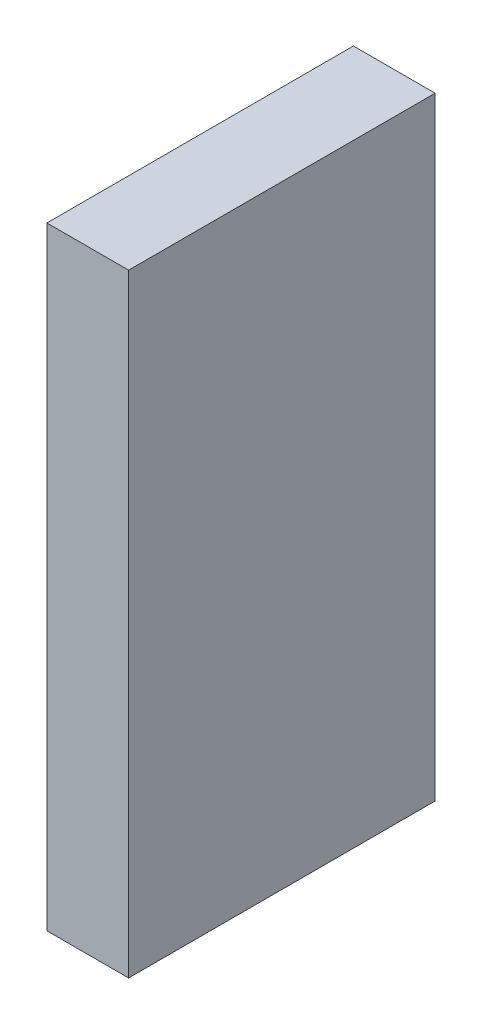
ISO-10303-21;
HEADER;
FILE_DESCRIPTION(('STEP AP214'),'2;1');
FILE_NAME('part.step','',(''),(''),'','','');
FILE_SCHEMA(('AUTOMOTIVE_DESIGN { 1 0 10303 214 1 1 1 1 }'));
ENDSEC;
DATA;
#1=APPLICATION_CONTEXT('core data for automotive mechanical design processes');
#2=APPLICATION_PROTOCOL_DEFINITION('international standard','automotive_design',2000,#1);
#3=PRODUCT_CONTEXT('',#1,'mechanical');
#4=PRODUCT('Part','Part','',(#3));
#5=PRODUCT_RELATED_PRODUCT_CATEGORY('part','',(#4));
#6=PRODUCT_DEFINITION_FORMATION('','',#4);
#7=PRODUCT_DEFINITION_CONTEXT('part definition',#1,'design');
#8=PRODUCT_DEFINITION('design','',#6,#7);
#9=PRODUCT_DEFINITION_SHAPE('','',#8);
#10=(LENGTH_UNIT() NAMED_UNIT(*) SI_UNIT(.MILLI.,.METRE.));
#11=(NAMED_UNIT(*) PLANE_ANGLE_UNIT() SI_UNIT($,.RADIAN.));
#12=(NAMED_UNIT(*) SI_UNIT($,.STERADIAN.) SOLID_ANGLE_UNIT());
#13=UNCERTAINTY_MEASURE_WITH_UNIT(LENGTH_MEASURE(1.E-05),#10,'distance_accuracy_value','');
#14=(GEOMETRIC_REPRESENTATION_CONTEXT(3) GLOBAL_UNCERTAINTY_ASSIGNED_CONTEXT((#13)) GLOBAL_UNIT_ASSIGNED_CONTEXT((#10,
#11,#12)) REPRESENTATION_CONTEXT('',''));
#15=CARTESIAN_POINT('',(0.,0.,0.));
#16=DIRECTION('',(0.,0.,1.));
#17=DIRECTION('',(1.,0.,0.));
#18=AXIS2_PLACEMENT_3D('',#15,#16,#17);
#19=CARTESIAN_POINT('',(146.,700.,-215.));
#20=DIRECTION('',(-1.,0.,0.));
#21=DIRECTION('',(0.,0.,1.));
#22=AXIS2_PLACEMENT_3D('',#19,#20,#21);
#23=PLANE('',#22);
#24=DIRECTION('',(0.,-1.,0.));
#25=VECTOR('',#24,1.);
#26=CARTESIAN_POINT('',(146.,700.,-185.));
#27=LINE('',#26,#25);
#28=CARTESIAN_POINT('',(146.,760.,-185.));
#29=VERTEX_POINT('',#28);
#30=CARTESIAN_POINT('',(146.,700.,-185.));
#31=VERTEX_POINT('',#30);
#32=EDGE_CURVE('E103',#29,#31,#27,.T.);
#33=ORIENTED_EDGE('',*,*,#32,.F.);
#34=DIRECTION('',(0.,0.,1.));
#35=VECTOR('',#34,1.);
#36=CARTESIAN_POINT('',(146.,760.,-215.));
#37=LINE('',#36,#35);
#38=CARTESIAN_POINT('',(146.,760.,-215.));
#39=VERTEX_POINT('',#38);
#40=EDGE_CURVE('E11',#39,#29,#37,.T.);
#41=ORIENTED_EDGE('',*,*,#40,.F.);
#42=DIRECTION('',(0.,-1.,0.));
#43=VECTOR('',#42,1.);
#44=CARTESIAN_POINT('',(146.,700.,-215.));
#45=LINE('',#44,#43);
#46=CARTESIAN_POINT('',(146.,700.,-215.));
#47=VERTEX_POINT('',#46);
#48=EDGE_CURVE('E97',#39,#47,#45,.T.);
#49=ORIENTED_EDGE('',*,*,#48,.T.);
#50=DIRECTION('',(0.,0.,1.));
#51=VECTOR('',#50,1.);
#52=CARTESIAN_POINT('',(146.,700.,-215.));
#53=LINE('',#52,#51);
#54=EDGE_CURVE('E42',#47,#31,#53,.T.);
#55=ORIENTED_EDGE('',*,*,#54,.T.);
#56=EDGE_LOOP('',(#33,#41,#49,#55));
#57=FACE_BOUND('',#56,.T.);
#58=ADVANCED_FACE('F39',(#57),#23,.T.);
#59=CARTESIAN_POINT('',(146.,760.,-215.));
#60=DIRECTION('',(0.,1.,0.));
#61=DIRECTION('',(0.,0.,1.));
#62=AXIS2_PLACEMENT_3D('',#59,#60,#61);
#63=PLANE('',#62);
#64=DIRECTION('',(-1.,0.,0.));
#65=VECTOR('',#64,1.);
#66=CARTESIAN_POINT('',(146.,760.,-185.));
#67=LINE('',#66,#65);
#68=CARTESIAN_POINT('',(154.,760.,-185.));
#69=VERTEX_POINT('',#68);
#70=EDGE_CURVE('E99',#69,#29,#67,.T.);
#71=ORIENTED_EDGE('',*,*,#70,.F.);
#72=DIRECTION('',(0.,0.,1.));
#73=VECTOR('',#72,1.);
#74=CARTESIAN_POINT('',(154.,760.,-215.));
#75=LINE('',#74,#73);
#76=CARTESIAN_POINT('',(154.,760.,-215.));
#77=VERTEX_POINT('',#76);
#78=EDGE_CURVE('E48',#77,#69,#75,.T.);
#79=ORIENTED_EDGE('',*,*,#78,.F.);
#80=DIRECTION('',(-1.,0.,0.));
#81=VECTOR('',#80,1.);
#82=CARTESIAN_POINT('',(146.,760.,-215.));
#83=LINE('',#82,#81);
#84=EDGE_CURVE('E94',#77,#39,#83,.T.);
#85=ORIENTED_EDGE('',*,*,#84,.T.);
#86=ORIENTED_EDGE('',*,*,#40,.T.);
#87=EDGE_LOOP('',(#71,#79,#85,#86));
#88=FACE_BOUND('',#87,.T.);
#89=ADVANCED_FACE('F113',(#88),#63,.T.);
#90=CARTESIAN_POINT('',(154.,700.,-215.));
#91=DIRECTION('',(1.,0.,0.));
#92=DIRECTION('',(0.,0.,-1.));
#93=AXIS2_PLACEMENT_3D('',#90,#91,#92);
#94=PLANE('',#93);
#95=DIRECTION('',(0.,1.,0.));
#96=VECTOR('',#95,1.);
#97=CARTESIAN_POINT('',(154.,700.,-185.));
#98=LINE('',#97,#96);
#99=CARTESIAN_POINT('',(154.,700.,-185.));
#100=VERTEX_POINT('',#99);
#101=EDGE_CURVE('E89',#100,#69,#98,.T.);
#102=ORIENTED_EDGE('',*,*,#101,.F.);
#103=DIRECTION('',(0.,0.,1.));
#104=VECTOR('',#103,1.);
#105=CARTESIAN_POINT('',(154.,700.,-215.));
#106=LINE('',#105,#104);
#107=CARTESIAN_POINT('',(154.,700.,-215.));
#108=VERTEX_POINT('',#107);
#109=EDGE_CURVE('E84',#108,#100,#106,.T.);
#110=ORIENTED_EDGE('',*,*,#109,.F.);
#111=DIRECTION('',(0.,1.,0.));
#112=VECTOR('',#111,1.);
#113=CARTESIAN_POINT('',(154.,700.,-215.));
#114=LINE('',#113,#112);
#115=EDGE_CURVE('E87',#108,#77,#114,.T.);
#116=ORIENTED_EDGE('',*,*,#115,.T.);
#117=ORIENTED_EDGE('',*,*,#78,.T.);
#118=EDGE_LOOP('',(#102,#110,#116,#117));
#119=FACE_BOUND('',#118,.T.);
#120=ADVANCED_FACE('F86',(#119),#94,.T.);
#121=CARTESIAN_POINT('',(146.,700.,-215.));
#122=DIRECTION('',(0.,-1.,0.));
#123=DIRECTION('',(0.,0.,-1.));
#124=AXIS2_PLACEMENT_3D('',#121,#122,#123);
#125=PLANE('',#124);
#126=DIRECTION('',(1.,0.,0.));
#127=VECTOR('',#126,1.);
#128=CARTESIAN_POINT('',(146.,700.,-185.));
#129=LINE('',#128,#127);
#130=EDGE_CURVE('E106',#31,#100,#129,.T.);
#131=ORIENTED_EDGE('',*,*,#130,.F.);
#132=ORIENTED_EDGE('',*,*,#54,.F.);
#133=DIRECTION('',(1.,0.,0.));
#134=VECTOR('',#133,1.);
#135=CARTESIAN_POINT('',(146.,700.,-215.));
#136=LINE('',#135,#134);
#137=EDGE_CURVE('E93',#47,#108,#136,.T.);
#138=ORIENTED_EDGE('',*,*,#137,.T.);
#139=ORIENTED_EDGE('',*,*,#109,.T.);
#140=EDGE_LOOP('',(#131,#132,#138,#139));
#141=FACE_BOUND('',#140,.T.);
#142=ADVANCED_FACE('F96',(#141),#125,.T.);
#143=CARTESIAN_POINT('',(0.,0.,-215.));
#144=DIRECTION('',(0.,0.,-1.));
#145=DIRECTION('',(-1.,0.,0.));
#146=AXIS2_PLACEMENT_3D('',#143,#144,#145);
#147=PLANE('',#146);
#148=ORIENTED_EDGE('',*,*,#48,.F.);
#149=ORIENTED_EDGE('',*,*,#84,.F.);
#150=ORIENTED_EDGE('',*,*,#115,.F.);
#151=ORIENTED_EDGE('',*,*,#137,.F.);
#152=EDGE_LOOP('',(#148,#149,#150,#151));
#153=FACE_BOUND('',#152,.T.);
#154=ADVANCED_FACE('F92',(#153),#147,.T.);
#155=CARTESIAN_POINT('',(0.,0.,-185.));
#156=DIRECTION('',(0.,0.,-1.));
#157=DIRECTION('',(-1.,0.,0.));
#158=AXIS2_PLACEMENT_3D('',#155,#156,#157);
#159=PLANE('',#158);
#160=ORIENTED_EDGE('',*,*,#32,.T.);
#161=ORIENTED_EDGE('',*,*,#130,.T.);
#162=ORIENTED_EDGE('',*,*,#101,.T.);
#163=ORIENTED_EDGE('',*,*,#70,.T.);
#164=EDGE_LOOP('',(#160,#161,#162,#163));
#165=FACE_BOUND('',#164,.T.);
#166=ADVANCED_FACE('F112',(#165),#159,.F.);
#167=CLOSED_SHELL('',(#58,#89,#120,#142,#154,#166));
#168=MANIFOLD_SOLID_BREP('B2',#167);
#169=ADVANCED_BREP_SHAPE_REPRESENTATION('',(#18,#168),#14);
#170=SHAPE_DEFINITION_REPRESENTATION(#9,#169);
ENDSEC;
END-ISO-10303-21;
